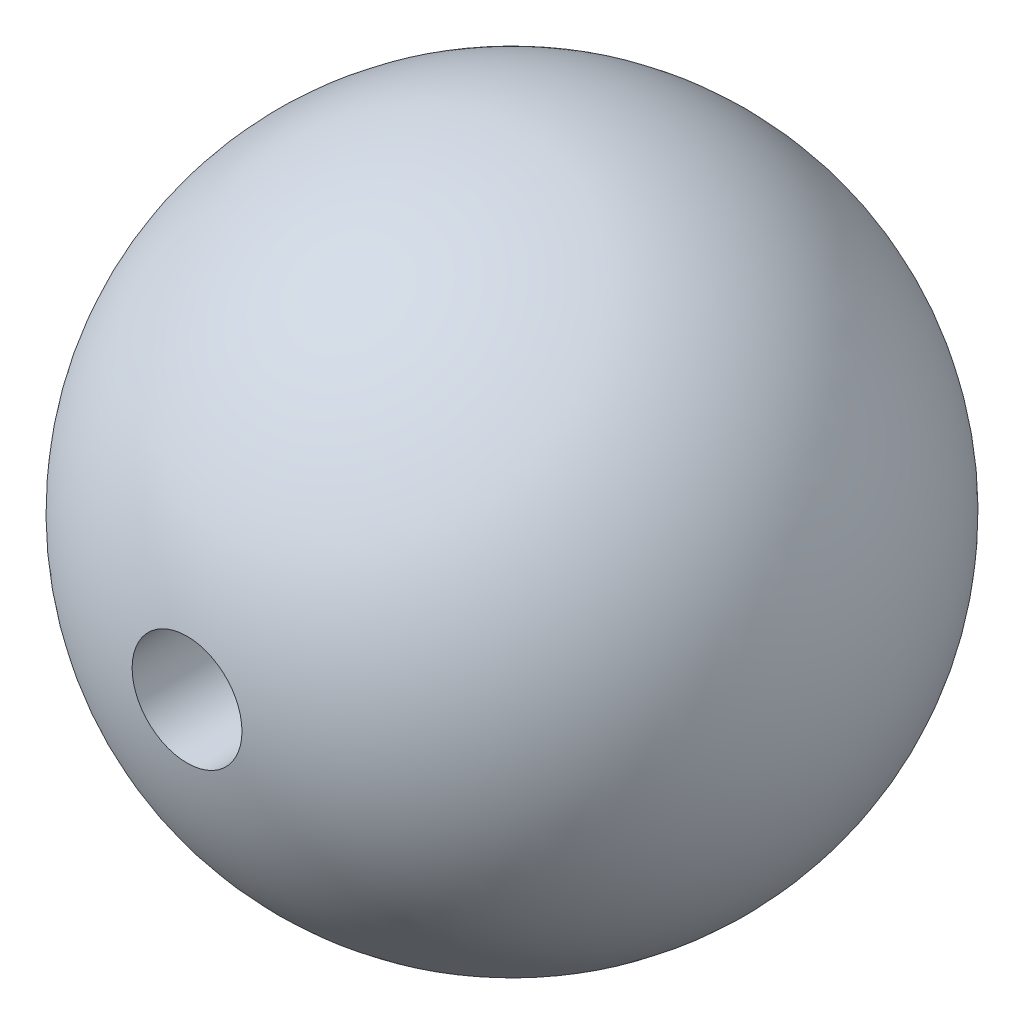
ISO-10303-21;
HEADER;
FILE_DESCRIPTION(('STEP AP214'),'2;1');
FILE_NAME('part.step','',(''),(''),'','','');
FILE_SCHEMA(('AUTOMOTIVE_DESIGN { 1 0 10303 214 1 1 1 1 }'));
ENDSEC;
DATA;
#1=APPLICATION_CONTEXT('core data for automotive mechanical design processes');
#2=APPLICATION_PROTOCOL_DEFINITION('international standard','automotive_design',2000,#1);
#3=PRODUCT_CONTEXT('',#1,'mechanical');
#4=PRODUCT('Part','Part','',(#3));
#5=PRODUCT_RELATED_PRODUCT_CATEGORY('part','',(#4));
#6=PRODUCT_DEFINITION_FORMATION('','',#4);
#7=PRODUCT_DEFINITION_CONTEXT('part definition',#1,'design');
#8=PRODUCT_DEFINITION('design','',#6,#7);
#9=PRODUCT_DEFINITION_SHAPE('','',#8);
#10=(LENGTH_UNIT() NAMED_UNIT(*) SI_UNIT(.MILLI.,.METRE.));
#11=(NAMED_UNIT(*) PLANE_ANGLE_UNIT() SI_UNIT($,.RADIAN.));
#12=(NAMED_UNIT(*) SI_UNIT($,.STERADIAN.) SOLID_ANGLE_UNIT());
#13=UNCERTAINTY_MEASURE_WITH_UNIT(LENGTH_MEASURE(1.E-05),#10,'distance_accuracy_value','');
#14=(GEOMETRIC_REPRESENTATION_CONTEXT(3) GLOBAL_UNCERTAINTY_ASSIGNED_CONTEXT((#13)) GLOBAL_UNIT_ASSIGNED_CONTEXT((#10,
#11,#12)) REPRESENTATION_CONTEXT('',''));
#15=CARTESIAN_POINT('',(0.,0.,0.));
#16=DIRECTION('',(0.,0.,1.));
#17=DIRECTION('',(1.,0.,0.));
#18=AXIS2_PLACEMENT_3D('',#15,#16,#17);
#19=CARTESIAN_POINT('',(0.,0.,0.));
#20=DIRECTION('',(0.,-1.,0.));
#21=DIRECTION('',(1.,0.,0.));
#22=AXIS2_PLACEMENT_3D('',#19,#20,#21);
#23=SPHERICAL_SURFACE('',#22,9.525);
#24=CARTESIAN_POINT('',(0.,0.,9.39177665567064));
#25=DIRECTION('',(0.,0.,-1.));
#26=DIRECTION('',(-1.,0.,0.));
#27=AXIS2_PLACEMENT_3D('',#24,#25,#26);
#28=CIRCLE('',#27,1.5875);
#29=CARTESIAN_POINT('',(-1.5875,0.,9.39177665567064));
#30=VERTEX_POINT('',#29);
#31=EDGE_CURVE('E47',#30,#30,#28,.F.);
#32=ORIENTED_EDGE('',*,*,#31,.F.);
#33=EDGE_LOOP('',(#32));
#34=FACE_BOUND('',#33,.T.);
#35=CARTESIAN_POINT('',(0.,0.,-9.39177665567064));
#36=DIRECTION('',(0.,0.,1.));
#37=DIRECTION('',(1.,0.,0.));
#38=AXIS2_PLACEMENT_3D('',#35,#36,#37);
#39=CIRCLE('',#38,1.5875);
#40=CARTESIAN_POINT('',(1.5875,0.,-9.39177665567064));
#41=VERTEX_POINT('',#40);
#42=EDGE_CURVE('E82',#41,#41,#39,.F.);
#43=ORIENTED_EDGE('',*,*,#42,.F.);
#44=EDGE_LOOP('',(#43));
#45=FACE_BOUND('',#44,.T.);
#46=CARTESIAN_POINT('',(0.,-8.66169794208964,0.));
#47=DIRECTION('',(0.,-1.,0.));
#48=DIRECTION('',(0.,0.,-1.));
#49=AXIS2_PLACEMENT_3D('',#46,#47,#48);
#50=CIRCLE('',#49,3.9624);
#51=CARTESIAN_POINT('',(0.,-8.66169794208964,-3.9624));
#52=VERTEX_POINT('',#51);
#53=EDGE_CURVE('E42',#52,#52,#50,.T.);
#54=ORIENTED_EDGE('',*,*,#53,.F.);
#55=EDGE_LOOP('',(#54));
#56=FACE_BOUND('',#55,.T.);
#57=ADVANCED_FACE('F30',(#34,#45,#56),#23,.T.);
#58=CARTESIAN_POINT('',(0.,3.175,0.));
#59=DIRECTION('',(0.,-1.,0.));
#60=DIRECTION('',(0.,0.,-1.));
#61=AXIS2_PLACEMENT_3D('',#58,#59,#60);
#62=PLANE('',#61);
#63=CARTESIAN_POINT('',(0.,3.175,0.));
#64=DIRECTION('',(0.,-1.,0.));
#65=DIRECTION('',(0.,0.,-1.));
#66=AXIS2_PLACEMENT_3D('',#63,#64,#65);
#67=CIRCLE('',#66,3.9624);
#68=CARTESIAN_POINT('',(0.,3.175,-3.9624));
#69=VERTEX_POINT('',#68);
#70=EDGE_CURVE('E10',#69,#69,#67,.T.);
#71=ORIENTED_EDGE('',*,*,#70,.T.);
#72=EDGE_LOOP('',(#71));
#73=FACE_BOUND('',#72,.T.);
#74=ADVANCED_FACE('F68',(#73),#62,.T.);
#75=CARTESIAN_POINT('',(0.,3.175,0.));
#76=DIRECTION('',(0.,-1.,0.));
#77=DIRECTION('',(0.,0.,-1.));
#78=AXIS2_PLACEMENT_3D('',#75,#76,#77);
#79=CYLINDRICAL_SURFACE('',#78,3.9624);
#80=CARTESIAN_POINT('',(0.,1.5875,-3.9624));
#81=CARTESIAN_POINT('',(-0.0853117270718672,1.58749211930106,-3.96239416664373));
#82=CARTESIAN_POINT('',(-0.170771012783032,1.58058204726005,-3.95961253187258));
#83=CARTESIAN_POINT('',(-0.339280209794605,1.55318133192485,-3.94875664272095));
#84=CARTESIAN_POINT('',(-0.422322940365625,1.53265382430656,-3.94066802223273));
#85=CARTESIAN_POINT('',(-0.58328993969218,1.47888529051548,-3.92006972049317));
#86=CARTESIAN_POINT('',(-0.661230017057728,1.44568594252038,-3.90757454272));
#87=CARTESIAN_POINT('',(-0.810363301587511,1.36768180814705,-3.87939329710751));
#88=CARTESIAN_POINT('',(-0.881558827817698,1.32288103076507,-3.863708331934));
#89=CARTESIAN_POINT('',(-1.01864732948285,1.22070983361455,-3.82990464333274));
#90=CARTESIAN_POINT('',(-1.08418010359647,1.16288133563253,-3.81171021752442));
#91=CARTESIAN_POINT('',(-1.20492218930694,1.03726313625752,-3.7752829774358));
#92=CARTESIAN_POINT('',(-1.26012643608791,0.969468576736823,-3.75705014873227));
#93=CARTESIAN_POINT('',(-1.36107386243811,0.822164437137006,-3.72170442663272));
#94=CARTESIAN_POINT('',(-1.40628412127964,0.742266770002609,-3.70467796939796));
#95=CARTESIAN_POINT('',(-1.4824632905671,0.57521696793719,-3.67486086596433));
#96=CARTESIAN_POINT('',(-1.51343898680089,0.488068313090151,-3.66206820228051));
#97=CARTESIAN_POINT('',(-1.55881183659324,0.313129379937859,-3.64298009307871));
#98=CARTESIAN_POINT('',(-1.57389868874412,0.22554840510339,-3.63641570103484));
#99=CARTESIAN_POINT('',(-1.58921987839996,0.0488708701643143,-3.62974807106187));
#100=CARTESIAN_POINT('',(-1.58946155192944,-0.0402249195914007,-3.62964164180919));
#101=CARTESIAN_POINT('',(-1.575608087631,-0.210765770593199,-3.6356726055801));
#102=CARTESIAN_POINT('',(-1.56251330699092,-0.292310497958319,-3.64137433896395));
#103=CARTESIAN_POINT('',(-1.5240270084585,-0.451929975312635,-3.65764778306397));
#104=CARTESIAN_POINT('',(-1.49863333724794,-0.530004115048953,-3.66822034656052));
#105=CARTESIAN_POINT('',(-1.43578621930772,-0.682353002714171,-3.69327658525766));
#106=CARTESIAN_POINT('',(-1.39809683496274,-0.756517443579267,-3.7078358006729));
#107=CARTESIAN_POINT('',(-1.31189385068063,-0.897742356999456,-3.73920425029952));
#108=CARTESIAN_POINT('',(-1.26337617722401,-0.964800142046522,-3.75601433031439));
#109=CARTESIAN_POINT('',(-1.15247025125588,-1.09538227966191,-3.79157859533404));
#110=CARTESIAN_POINT('',(-1.08929797701747,-1.15822901314648,-3.81038243478567));
#111=CARTESIAN_POINT('',(-0.953110948774044,-1.272653703119,-3.84670714404858));
#112=CARTESIAN_POINT('',(-0.880094226746659,-1.32422940097551,-3.86422775624386));
#113=CARTESIAN_POINT('',(-0.724363732588359,-1.41554113785356,-3.89645338462923));
#114=CARTESIAN_POINT('',(-0.641486057700651,-1.45502145644825,-3.91109551133595));
#115=CARTESIAN_POINT('',(-0.469530085969015,-1.51924620789086,-3.93543864002887));
#116=CARTESIAN_POINT('',(-0.380454975359993,-1.54399815129254,-3.94514216003095));
#117=CARTESIAN_POINT('',(-0.204311847288936,-1.57669128161821,-3.95805539170234));
#118=CARTESIAN_POINT('',(-0.117438504602531,-1.5855430577553,-3.96161635318634));
#119=CARTESIAN_POINT('',(0.0566169135851247,-1.58887432761563,-3.96295024554235));
#120=CARTESIAN_POINT('',(0.143798902846543,-1.58335756145793,-3.96072468264188));
#121=CARTESIAN_POINT('',(0.311864203819767,-1.55877721223898,-3.95096541555836));
#122=CARTESIAN_POINT('',(0.392854247186952,-1.54033589846701,-3.94367566936803));
#123=CARTESIAN_POINT('',(0.550515216479773,-1.4912773776295,-3.92477456539392));
#124=CARTESIAN_POINT('',(0.627185586437011,-1.4606586073193,-3.9131626527772));
#125=CARTESIAN_POINT('',(0.776671825040636,-1.3871152245476,-3.88630174678252));
#126=CARTESIAN_POINT('',(0.849297865243658,-1.34384261411415,-3.87095230097636));
#127=CARTESIAN_POINT('',(0.986513042497236,-1.24660586359978,-3.83827939599823));
#128=CARTESIAN_POINT('',(1.05109893605944,-1.19263743131032,-3.82095514553132));
#129=CARTESIAN_POINT('',(1.17488814946077,-1.07134956464301,-3.78479622435235));
#130=CARTESIAN_POINT('',(1.23345169378678,-1.00338262689443,-3.76593750910618));
#131=CARTESIAN_POINT('',(1.3384999511022,-0.858253679288924,-3.72989598565993));
#132=CARTESIAN_POINT('',(1.38498264693781,-0.781090136997127,-3.71271345763364));
#133=CARTESIAN_POINT('',(1.46485133239264,-0.618578385223202,-3.68194013043205));
#134=CARTESIAN_POINT('',(1.4981038159132,-0.533157046377298,-3.66838637510372));
#135=CARTESIAN_POINT('',(1.5494941460913,-0.357220223057037,-3.64698112621987));
#136=CARTESIAN_POINT('',(1.56764319695997,-0.266708568053327,-3.63912540623532));
#137=CARTESIAN_POINT('',(1.58723971665742,-0.0901981792953834,-3.63061804319504));
#138=CARTESIAN_POINT('',(1.58979784556332,-0.0043450794362353,-3.62948746901891));
#139=CARTESIAN_POINT('',(1.58105828726622,0.16650668272671,-3.63330307077312));
#140=CARTESIAN_POINT('',(1.56976237222211,0.251505452911165,-3.63824846948727));
#141=CARTESIAN_POINT('',(1.53454341699213,0.4147688823369,-3.65323574640425));
#142=CARTESIAN_POINT('',(1.51114082490252,0.493166917752751,-3.66306695290777));
#143=CARTESIAN_POINT('',(1.45286057138561,0.644954659742314,-3.68656914433929));
#144=CARTESIAN_POINT('',(1.41797973865852,0.718342975417013,-3.70024119029212));
#145=CARTESIAN_POINT('',(1.3354212120285,0.862615526604616,-3.73085856653308));
#146=CARTESIAN_POINT('',(1.28712414414707,0.933114531596545,-3.74794669035745));
#147=CARTESIAN_POINT('',(1.18000808273821,1.0653557778298,-3.78303688506396));
#148=CARTESIAN_POINT('',(1.12118589927164,1.12709535407475,-3.8010392318397));
#149=CARTESIAN_POINT('',(0.990129236409029,1.24419200221078,-3.83733892894263));
#150=CARTESIAN_POINT('',(0.917270721586571,1.29887145882592,-3.85557912432533));
#151=CARTESIAN_POINT('',(0.762721357089438,1.39524279467017,-3.88910173721633));
#152=CARTESIAN_POINT('',(0.681026427799039,1.43692864020734,-3.90438277937339));
#153=CARTESIAN_POINT('',(0.512612293189795,1.50515468741471,-3.93000833052496));
#154=CARTESIAN_POINT('',(0.426014442405739,1.53196156880167,-3.94043917717235));
#155=CARTESIAN_POINT('',(0.249201615949018,1.57040986772659,-3.95554325966711));
#156=CARTESIAN_POINT('',(0.158999059586055,1.58209938833736,-3.96023475540089));
#157=CARTESIAN_POINT('',(0.0457330899803877,1.58700812237842,-3.96220361378713));
#158=CARTESIAN_POINT('',(0.0228718479665297,1.5875021127945,-3.96240156390736));
#159=CARTESIAN_POINT('',(0.,1.5875,-3.9624));
#160=B_SPLINE_CURVE_WITH_KNOTS('',3,(#80,#81,#82,#83,#84,#85,#86,#87,#88,#89,#90,#91,#92,#93,
#94,#95,#96,#97,#98,#99,#100,#101,#102,#103,#104,#105,#106,#107,#108,#109,#110,#111,#112,#113,
#114,#115,#116,#117,#118,#119,#120,#121,#122,#123,#124,#125,#126,#127,#128,#129,#130,#131,#132,
#133,#134,#135,#136,#137,#138,#139,#140,#141,#142,#143,#144,#145,#146,#147,#148,#149,#150,#151,
#152,#153,#154,#155,#156,#157,#158,#159),.UNSPECIFIED.,.T.,.F.,(4,2,2,2,2,2,2,2,2,2,2,2,2,2,2,2,
2,2,2,2,2,2,2,2,2,2,2,2,2,2,2,2,2,2,2,2,2,2,2,4),(0.,0.255873929494163,0.512443388183724,
0.768176151866853,1.02382066204937,1.2904702136267,1.55725018179778,1.8359498024818,
2.11451642551445,2.38041834160662,2.64618885620301,2.89339325556369,3.1406409516974,
3.39294340285309,3.64534092872686,3.9173176007395,4.1893487249715,4.46678713369948,
4.74408394461069,5.00492203806862,5.26569224238361,5.51470010088076,5.76373993534178,
6.02040300035023,6.27716927297268,6.55094094110412,6.82475829189516,7.1012726199954,
7.37758163757344,7.63395264349523,7.89029085879074,8.1364269015365,8.38263100588646,
8.64296045355352,8.90336893560795,9.18073833868855,9.45823634935123,9.73058529806197,
10.0020654893605,10.0706646118358),.UNSPECIFIED.);
#161=CARTESIAN_POINT('',(0.,1.5875,-3.9624));
#162=VERTEX_POINT('',#161);
#163=EDGE_CURVE('E33',#162,#162,#160,.T.);
#164=ORIENTED_EDGE('',*,*,#163,.F.);
#165=EDGE_LOOP('',(#164));
#166=FACE_BOUND('',#165,.T.);
#167=CARTESIAN_POINT('',(1.5875,0.,3.63048998208231));
#168=CARTESIAN_POINT('',(1.58749065633051,-0.0850293845381577,3.63049860166506));
#169=CARTESIAN_POINT('',(1.5806280386829,-0.170178320331612,3.63351930596472));
#170=CARTESIAN_POINT('',(1.55343427483823,-0.338032825115651,3.64522429294601));
#171=CARTESIAN_POINT('',(1.53306877953105,-0.420731599345272,3.65392301870693));
#172=CARTESIAN_POINT('',(1.47977266239197,-0.580972730810104,3.6758274235157));
#173=CARTESIAN_POINT('',(1.44688947517429,-0.658533272000699,3.68901606873711));
#174=CARTESIAN_POINT('',(1.36963001807659,-0.807018822459914,3.71839056207649));
#175=CARTESIAN_POINT('',(1.3252562303428,-0.877945260298232,3.73457576267749));
#176=CARTESIAN_POINT('',(1.22355108799482,-1.01525966276955,3.7691595137997));
#177=CARTESIAN_POINT('',(1.16566565871303,-1.0812194589445,3.78762941074348));
#178=CARTESIAN_POINT('',(1.03974672153168,-1.20280795661352,3.82411226056762));
#179=CARTESIAN_POINT('',(0.971709676362411,-1.25843304181041,3.84212505160211));
#180=CARTESIAN_POINT('',(0.82410908956461,-1.35990071148356,3.87652106762559));
#181=CARTESIAN_POINT('',(0.744195920297107,-1.40526897717645,3.89281157889371));
#182=CARTESIAN_POINT('',(0.577102307633451,-1.48173569900398,3.92106236727906));
#183=CARTESIAN_POINT('',(0.489924847591711,-1.51283997938152,3.933024411366));
#184=CARTESIAN_POINT('',(0.315267314673553,-1.55836674746694,3.95076527021463));
#185=CARTESIAN_POINT('',(0.228007430733212,-1.57352583717539,3.95681609122412));
#186=CARTESIAN_POINT('',(0.0519866998195756,-1.58910412726288,3.9630360750103));
#187=CARTESIAN_POINT('',(-0.0367735730163086,-1.58952884361591,3.96320743882591));
#188=CARTESIAN_POINT('',(-0.207949906853732,-1.57602947504612,3.95781451142904));
#189=CARTESIAN_POINT('',(-0.290441633410346,-1.56291255069481,3.95257286194732));
#190=CARTESIAN_POINT('',(-0.451939194524751,-1.52407557798912,3.93737807246517));
#191=CARTESIAN_POINT('',(-0.53094477277812,-1.49835460465225,3.92742458667561));
#192=CARTESIAN_POINT('',(-0.684652184104046,-1.43472409804159,3.90358943514598));
#193=CARTESIAN_POINT('',(-0.759271143743957,-1.39663659916509,3.88965079236787));
#194=CARTESIAN_POINT('',(-0.901251277650391,-1.30952124764734,3.85922785772182));
#195=CARTESIAN_POINT('',(-0.968609949217904,-1.2604896402264,3.84274269277477));
#196=CARTESIAN_POINT('',(-1.09886592962499,-1.14911576141392,3.80761790365709));
#197=CARTESIAN_POINT('',(-1.16117751121798,-1.08610966450852,3.78890789152213));
#198=CARTESIAN_POINT('',(-1.27459067863638,-0.950470392145239,3.75227824677165));
#199=CARTESIAN_POINT('',(-1.32568857135318,-0.87783405766775,3.73435887609313));
#200=CARTESIAN_POINT('',(-1.41656981233453,-0.722369067178065,3.70085976659175));
#201=CARTESIAN_POINT('',(-1.45599039620024,-0.639309441871138,3.68536097780276));
#202=CARTESIAN_POINT('',(-1.52005182761746,-0.466944461356522,3.6594077545824));
#203=CARTESIAN_POINT('',(-1.54470231112915,-0.377643220718839,3.64895003225009));
#204=CARTESIAN_POINT('',(-1.5770965133273,-0.201173783136034,3.63506177785545));
#205=CARTESIAN_POINT('',(-1.58578317134363,-0.114209878975291,3.63124011374553));
#206=CARTESIAN_POINT('',(-1.58875397256679,0.0599980236615336,3.62994222523246));
#207=CARTESIAN_POINT('',(-1.58304250530684,0.14724192867516,3.63246406689443));
#208=CARTESIAN_POINT('',(-1.55823779642886,0.314284728998989,3.64316752573291));
#209=CARTESIAN_POINT('',(-1.53992890484142,0.394223989997881,3.65101705710506));
#210=CARTESIAN_POINT('',(-1.49146743619686,0.549842334533402,3.67107904094349));
#211=CARTESIAN_POINT('',(-1.46131222775466,0.625520467285972,3.68329246269244));
#212=CARTESIAN_POINT('',(-1.38864671191942,0.773897275694289,3.71131306850803));
#213=CARTESIAN_POINT('',(-1.34568423093519,0.846349998075656,3.72724609634123));
#214=CARTESIAN_POINT('',(-1.24908549925998,0.983348078567969,3.7607192537747));
#215=CARTESIAN_POINT('',(-1.19544489078507,1.04789019089708,3.77826003792424));
#216=CARTESIAN_POINT('',(-1.0743173295744,1.17220946762932,3.8145427293604));
#217=CARTESIAN_POINT('',(-1.00609861662742,1.23127848857376,3.83327726112235));
#218=CARTESIAN_POINT('',(-0.860270332155506,1.3372409189738,3.86861354480797));
#219=CARTESIAN_POINT('',(-0.782660368015927,1.38413381913133,3.88521520750415));
#220=CARTESIAN_POINT('',(-0.619969034383934,1.46424392285373,3.91446977344994));
#221=CARTESIAN_POINT('',(-0.534888728095197,1.49746306869676,3.92712323745666));
#222=CARTESIAN_POINT('',(-0.359715491215378,1.54889677584827,3.94702042089247));
#223=CARTESIAN_POINT('',(-0.269625319353446,1.56711950941469,3.95426708654169));
#224=CARTESIAN_POINT('',(-0.0933465475917374,1.58707006649125,3.96221831360211));
#225=CARTESIAN_POINT('',(-0.00728829442002241,1.5897990367533,3.96331986080945));
#226=CARTESIAN_POINT('',(0.164018576016508,1.58133019740128,3.95993014534731));
#227=CARTESIAN_POINT('',(0.249267314532395,1.57013450770008,3.95543973400656));
#228=CARTESIAN_POINT('',(0.413834923342553,1.5348497199105,3.94156960694888));
#229=CARTESIAN_POINT('',(0.493255625112019,1.5111696131634,3.9323452183939));
#230=CARTESIAN_POINT('',(0.646981594384495,1.45201854905173,3.90999589418671));
#231=CARTESIAN_POINT('',(0.721285916839035,1.41654542040808,3.89687024029796));
#232=CARTESIAN_POINT('',(0.866282923379315,1.33304789550676,3.86728397994749));
#233=CARTESIAN_POINT('',(0.936670455235368,1.28453770773726,3.85070153581702));
#234=CARTESIAN_POINT('',(1.06860248328371,1.17706856586816,3.81619715197458));
#235=CARTESIAN_POINT('',(1.13014328339425,1.118105267399,3.79827465712802));
#236=CARTESIAN_POINT('',(1.2465916081757,0.987075026556042,3.76172535168452));
#237=CARTESIAN_POINT('',(1.30084921065205,0.914421463771361,3.74312399092213));
#238=CARTESIAN_POINT('',(1.39645088057639,0.760450834668668,3.70852195241108));
#239=CARTESIAN_POINT('',(1.43779344628619,0.679132762329653,3.69252157720419));
#240=CARTESIAN_POINT('',(1.50305593202854,0.517569363304279,3.66640976376903));
#241=CARTESIAN_POINT('',(1.5282087119244,0.437885753602078,3.65589801573786));
#242=CARTESIAN_POINT('',(1.56567684110845,0.27520425943001,3.64001365683373));
#243=CARTESIAN_POINT('',(1.57802792408541,0.192216275526493,3.63462674435827));
#244=CARTESIAN_POINT('',(1.58625841384787,0.0725937353082927,3.63103181794639));
#245=CARTESIAN_POINT('',(1.58750398977098,0.0363077666162907,3.63048630149823));
#246=CARTESIAN_POINT('',(1.5875,0.,3.63048998208231));
#247=B_SPLINE_CURVE_WITH_KNOTS('',3,(#167,#168,#169,#170,#171,#172,#173,#174,#175,#176,#177,
#178,#179,#180,#181,#182,#183,#184,#185,#186,#187,#188,#189,#190,#191,#192,#193,#194,#195,#196,
#197,#198,#199,#200,#201,#202,#203,#204,#205,#206,#207,#208,#209,#210,#211,#212,#213,#214,#215,
#216,#217,#218,#219,#220,#221,#222,#223,#224,#225,#226,#227,#228,#229,#230,#231,#232,#233,#234,
#235,#236,#237,#238,#239,#240,#241,#242,#243,#244,#245,#246),.UNSPECIFIED.,.T.,.F.,(4,2,2,2,2,2,
2,2,2,2,2,2,2,2,2,2,2,2,2,2,2,2,2,2,2,2,2,2,2,2,2,2,2,2,2,2,2,2,2,4),(0.,0.254975059857851,
0.510601235908144,0.765268230907545,1.01988025974785,1.2877402919308,1.55569387724707,
1.83425280969733,2.11269790000774,2.37762413584636,2.64245119257701,2.89235609221845,
3.14227933455946,3.39597166537711,3.64975116884934,3.92023946994151,4.19081672022149,
4.46908250974916,4.74716656145542,5.00822041169194,5.26919468448779,5.5152370353265,
5.76133406970851,6.01742918295331,6.27362902463017,6.54882529246467,6.82403306924858,
7.09920174084939,7.37422036047743,7.6312465026493,7.88823351953262,8.13728161881958,
8.38637559716011,8.64648818701371,8.90670913559177,9.18310200074598,9.45952699243324,
9.71108213833467,9.96193320560452,10.0708082141275),.UNSPECIFIED.);
#248=CARTESIAN_POINT('',(1.5875,0.,3.63048998208231));
#249=VERTEX_POINT('',#248);
#250=EDGE_CURVE('E50',#249,#249,#247,.T.);
#251=ORIENTED_EDGE('',*,*,#250,.F.);
#252=EDGE_LOOP('',(#251));
#253=FACE_BOUND('',#252,.T.);
#254=ORIENTED_EDGE('',*,*,#53,.T.);
#255=EDGE_LOOP('',(#254));
#256=FACE_BOUND('',#255,.T.);
#257=ORIENTED_EDGE('',*,*,#70,.F.);
#258=EDGE_LOOP('',(#257));
#259=FACE_BOUND('',#258,.T.);
#260=ADVANCED_FACE('F55',(#166,#253,#256,#259),#79,.F.);
#261=CARTESIAN_POINT('',(0.,0.,-9.525));
#262=DIRECTION('',(0.,0.,1.));
#263=DIRECTION('',(1.,0.,0.));
#264=AXIS2_PLACEMENT_3D('',#261,#262,#263);
#265=CYLINDRICAL_SURFACE('',#264,1.5875);
#266=ORIENTED_EDGE('',*,*,#31,.T.);
#267=EDGE_LOOP('',(#266));
#268=FACE_BOUND('',#267,.T.);
#269=ORIENTED_EDGE('',*,*,#250,.T.);
#270=EDGE_LOOP('',(#269));
#271=FACE_BOUND('',#270,.T.);
#272=ADVANCED_FACE('F57',(#268,#271),#265,.F.);
#273=ORIENTED_EDGE('',*,*,#42,.T.);
#274=EDGE_LOOP('',(#273));
#275=FACE_BOUND('',#274,.T.);
#276=ORIENTED_EDGE('',*,*,#163,.T.);
#277=EDGE_LOOP('',(#276));
#278=FACE_BOUND('',#277,.T.);
#279=ADVANCED_FACE('F60',(#275,#278),#265,.F.);
#280=CLOSED_SHELL('',(#57,#74,#260,#272,#279));
#281=MANIFOLD_SOLID_BREP('B2',#280);
#282=ADVANCED_BREP_SHAPE_REPRESENTATION('',(#18,#281),#14);
#283=SHAPE_DEFINITION_REPRESENTATION(#9,#282);
ENDSEC;
END-ISO-10303-21;
